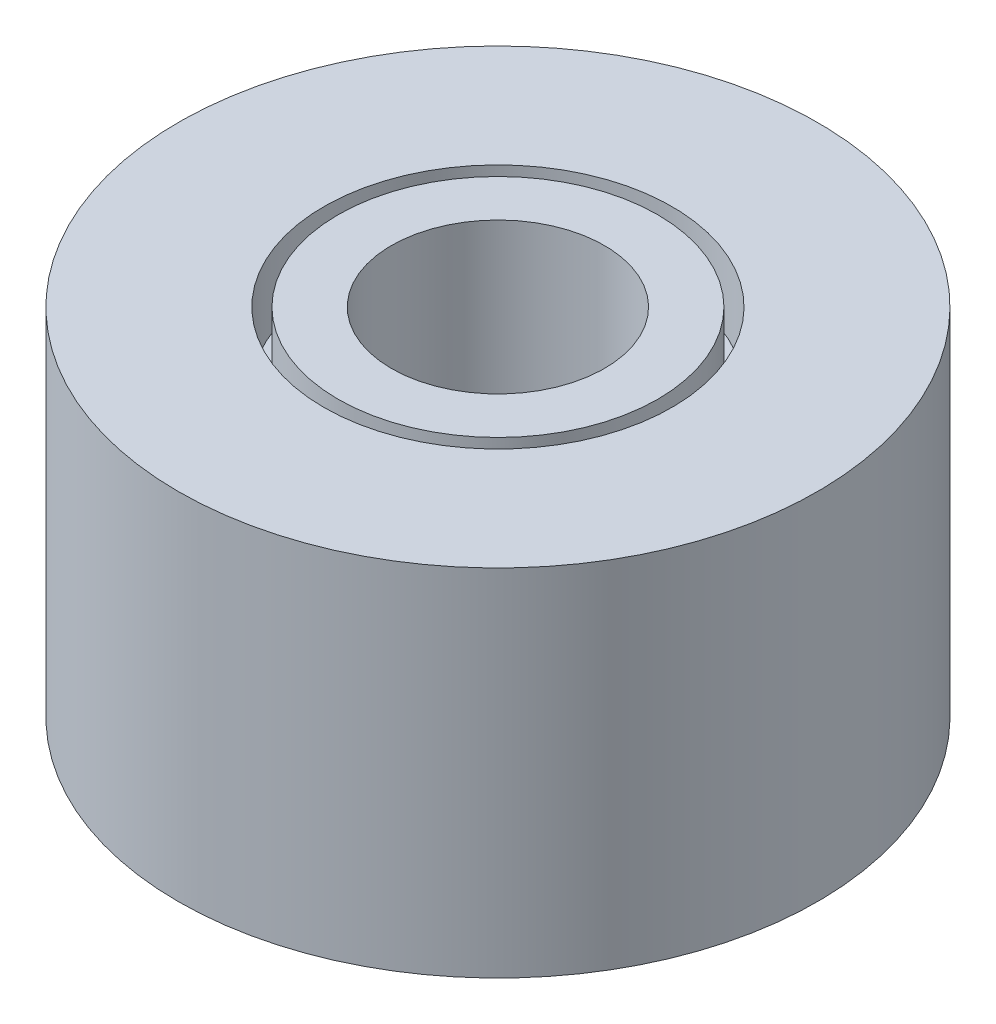
ISO-10303-21;
HEADER;
FILE_DESCRIPTION(('STEP AP214'),'2;1');
FILE_NAME('part.step','',(''),(''),'','','');
FILE_SCHEMA(('AUTOMOTIVE_DESIGN { 1 0 10303 214 1 1 1 1 }'));
ENDSEC;
DATA;
#1=APPLICATION_CONTEXT('core data for automotive mechanical design processes');
#2=APPLICATION_PROTOCOL_DEFINITION('international standard','automotive_design',2000,#1);
#3=PRODUCT_CONTEXT('',#1,'mechanical');
#4=PRODUCT('Part','Part','',(#3));
#5=PRODUCT_RELATED_PRODUCT_CATEGORY('part','',(#4));
#6=PRODUCT_DEFINITION_FORMATION('','',#4);
#7=PRODUCT_DEFINITION_CONTEXT('part definition',#1,'design');
#8=PRODUCT_DEFINITION('design','',#6,#7);
#9=PRODUCT_DEFINITION_SHAPE('','',#8);
#10=(LENGTH_UNIT() NAMED_UNIT(*) SI_UNIT(.MILLI.,.METRE.));
#11=(NAMED_UNIT(*) PLANE_ANGLE_UNIT() SI_UNIT($,.RADIAN.));
#12=(NAMED_UNIT(*) SI_UNIT($,.STERADIAN.) SOLID_ANGLE_UNIT());
#13=UNCERTAINTY_MEASURE_WITH_UNIT(LENGTH_MEASURE(1.E-05),#10,'distance_accuracy_value','');
#14=(GEOMETRIC_REPRESENTATION_CONTEXT(3) GLOBAL_UNCERTAINTY_ASSIGNED_CONTEXT((#13)) GLOBAL_UNIT_ASSIGNED_CONTEXT((#10,
#11,#12)) REPRESENTATION_CONTEXT('',''));
#15=CARTESIAN_POINT('',(0.,0.,0.));
#16=DIRECTION('',(0.,0.,1.));
#17=DIRECTION('',(1.,0.,0.));
#18=AXIS2_PLACEMENT_3D('',#15,#16,#17);
#19=CARTESIAN_POINT('',(0.,5.,0.));
#20=DIRECTION('',(0.,1.,0.));
#21=DIRECTION('',(0.,0.,1.));
#22=AXIS2_PLACEMENT_3D('',#19,#20,#21);
#23=PLANE('',#22);
#24=CARTESIAN_POINT('',(0.,5.,0.));
#25=DIRECTION('',(0.,1.,0.));
#26=DIRECTION('',(0.,0.,1.));
#27=AXIS2_PLACEMENT_3D('',#24,#25,#26);
#28=CIRCLE('',#27,1.5);
#29=CARTESIAN_POINT('',(0.,5.,1.5));
#30=VERTEX_POINT('',#29);
#31=EDGE_CURVE('E62',#30,#30,#28,.T.);
#32=ORIENTED_EDGE('',*,*,#31,.F.);
#33=EDGE_LOOP('',(#32));
#34=FACE_BOUND('',#33,.T.);
#35=CARTESIAN_POINT('',(0.,5.,0.));
#36=DIRECTION('',(0.,1.,0.));
#37=DIRECTION('',(0.,0.,1.));
#38=AXIS2_PLACEMENT_3D('',#35,#36,#37);
#39=CIRCLE('',#38,2.25);
#40=CARTESIAN_POINT('',(0.,5.,2.25));
#41=VERTEX_POINT('',#40);
#42=EDGE_CURVE('E88',#41,#41,#39,.T.);
#43=ORIENTED_EDGE('',*,*,#42,.T.);
#44=EDGE_LOOP('',(#43));
#45=FACE_BOUND('',#44,.T.);
#46=ADVANCED_FACE('F51',(#34,#45),#23,.T.);
#47=CARTESIAN_POINT('',(0.,0.,0.));
#48=DIRECTION('',(0.,1.,0.));
#49=DIRECTION('',(0.,0.,1.));
#50=AXIS2_PLACEMENT_3D('',#47,#48,#49);
#51=PLANE('',#50);
#52=CARTESIAN_POINT('',(0.,0.,0.));
#53=DIRECTION('',(0.,1.,0.));
#54=DIRECTION('',(0.,0.,1.));
#55=AXIS2_PLACEMENT_3D('',#52,#53,#54);
#56=CIRCLE('',#55,1.5);
#57=CARTESIAN_POINT('',(0.,0.,1.5));
#58=VERTEX_POINT('',#57);
#59=EDGE_CURVE('E64',#58,#58,#56,.T.);
#60=ORIENTED_EDGE('',*,*,#59,.T.);
#61=EDGE_LOOP('',(#60));
#62=FACE_BOUND('',#61,.T.);
#63=CARTESIAN_POINT('',(0.,0.,0.));
#64=DIRECTION('',(0.,1.,0.));
#65=DIRECTION('',(0.,0.,1.));
#66=AXIS2_PLACEMENT_3D('',#63,#64,#65);
#67=CIRCLE('',#66,2.25);
#68=CARTESIAN_POINT('',(0.,0.,2.25));
#69=VERTEX_POINT('',#68);
#70=EDGE_CURVE('E76',#69,#69,#67,.T.);
#71=ORIENTED_EDGE('',*,*,#70,.F.);
#72=EDGE_LOOP('',(#71));
#73=FACE_BOUND('',#72,.T.);
#74=ADVANCED_FACE('F113',(#62,#73),#51,.F.);
#75=CARTESIAN_POINT('',(0.,5.,0.));
#76=DIRECTION('',(0.,1.,0.));
#77=DIRECTION('',(0.,0.,1.));
#78=AXIS2_PLACEMENT_3D('',#75,#76,#77);
#79=CIRCLE('',#78,2.45);
#80=CARTESIAN_POINT('',(0.,5.,2.45));
#81=VERTEX_POINT('',#80);
#82=EDGE_CURVE('E82',#81,#81,#79,.T.);
#83=ORIENTED_EDGE('',*,*,#82,.F.);
#84=EDGE_LOOP('',(#83));
#85=FACE_BOUND('',#84,.T.);
#86=CARTESIAN_POINT('',(0.,5.,0.));
#87=DIRECTION('',(0.,1.,0.));
#88=DIRECTION('',(0.,0.,1.));
#89=AXIS2_PLACEMENT_3D('',#86,#87,#88);
#90=CIRCLE('',#89,4.5);
#91=CARTESIAN_POINT('',(0.,5.,4.5));
#92=VERTEX_POINT('',#91);
#93=EDGE_CURVE('E11',#92,#92,#90,.T.);
#94=ORIENTED_EDGE('',*,*,#93,.T.);
#95=EDGE_LOOP('',(#94));
#96=FACE_BOUND('',#95,.T.);
#97=ADVANCED_FACE('F110',(#85,#96),#23,.T.);
#98=CARTESIAN_POINT('',(0.,0.,0.));
#99=DIRECTION('',(0.,1.,0.));
#100=DIRECTION('',(1.,0.,0.));
#101=AXIS2_PLACEMENT_3D('',#98,#99,#100);
#102=CIRCLE('',#101,2.45);
#103=CARTESIAN_POINT('',(2.45,0.,0.));
#104=VERTEX_POINT('',#103);
#105=EDGE_CURVE('E70',#104,#104,#102,.T.);
#106=ORIENTED_EDGE('',*,*,#105,.T.);
#107=EDGE_LOOP('',(#106));
#108=FACE_BOUND('',#107,.T.);
#109=CARTESIAN_POINT('',(0.,0.,0.));
#110=DIRECTION('',(0.,1.,0.));
#111=DIRECTION('',(0.,0.,1.));
#112=AXIS2_PLACEMENT_3D('',#109,#110,#111);
#113=CIRCLE('',#112,4.5);
#114=CARTESIAN_POINT('',(0.,0.,4.5));
#115=VERTEX_POINT('',#114);
#116=EDGE_CURVE('E55',#115,#115,#113,.T.);
#117=ORIENTED_EDGE('',*,*,#116,.F.);
#118=EDGE_LOOP('',(#117));
#119=FACE_BOUND('',#118,.T.);
#120=ADVANCED_FACE('F112',(#108,#119),#51,.F.);
#121=CARTESIAN_POINT('',(0.,5.,0.));
#122=DIRECTION('',(0.,-1.,0.));
#123=DIRECTION('',(0.,0.,-1.));
#124=AXIS2_PLACEMENT_3D('',#121,#122,#123);
#125=CYLINDRICAL_SURFACE('',#124,4.5);
#126=ORIENTED_EDGE('',*,*,#93,.F.);
#127=EDGE_LOOP('',(#126));
#128=FACE_BOUND('',#127,.T.);
#129=ORIENTED_EDGE('',*,*,#116,.T.);
#130=EDGE_LOOP('',(#129));
#131=FACE_BOUND('',#130,.T.);
#132=ADVANCED_FACE('F53',(#128,#131),#125,.T.);
#133=CARTESIAN_POINT('',(0.,5.,0.));
#134=DIRECTION('',(0.,-1.,0.));
#135=DIRECTION('',(0.,0.,-1.));
#136=AXIS2_PLACEMENT_3D('',#133,#134,#135);
#137=CYLINDRICAL_SURFACE('',#136,1.5);
#138=ORIENTED_EDGE('',*,*,#31,.T.);
#139=EDGE_LOOP('',(#138));
#140=FACE_BOUND('',#139,.T.);
#141=ORIENTED_EDGE('',*,*,#59,.F.);
#142=EDGE_LOOP('',(#141));
#143=FACE_BOUND('',#142,.T.);
#144=ADVANCED_FACE('F141',(#140,#143),#137,.F.);
#145=CARTESIAN_POINT('',(0.,1.,0.));
#146=DIRECTION('',(0.,1.,0.));
#147=DIRECTION('',(0.,0.,1.));
#148=AXIS2_PLACEMENT_3D('',#145,#146,#147);
#149=PLANE('',#148);
#150=CARTESIAN_POINT('',(0.,1.,0.));
#151=DIRECTION('',(0.,1.,0.));
#152=DIRECTION('',(1.,0.,0.));
#153=AXIS2_PLACEMENT_3D('',#150,#151,#152);
#154=CIRCLE('',#153,2.45);
#155=CARTESIAN_POINT('',(2.45,1.,0.));
#156=VERTEX_POINT('',#155);
#157=EDGE_CURVE('E67',#156,#156,#154,.T.);
#158=ORIENTED_EDGE('',*,*,#157,.F.);
#159=EDGE_LOOP('',(#158));
#160=FACE_BOUND('',#159,.T.);
#161=CARTESIAN_POINT('',(0.,1.,0.));
#162=DIRECTION('',(0.,1.,0.));
#163=DIRECTION('',(0.,0.,1.));
#164=AXIS2_PLACEMENT_3D('',#161,#162,#163);
#165=CIRCLE('',#164,2.25);
#166=CARTESIAN_POINT('',(0.,1.,2.25));
#167=VERTEX_POINT('',#166);
#168=EDGE_CURVE('E73',#167,#167,#165,.T.);
#169=ORIENTED_EDGE('',*,*,#168,.T.);
#170=EDGE_LOOP('',(#169));
#171=FACE_BOUND('',#170,.T.);
#172=ADVANCED_FACE('F138',(#160,#171),#149,.F.);
#173=CARTESIAN_POINT('',(0.,1.,0.));
#174=DIRECTION('',(0.,-1.,0.));
#175=DIRECTION('',(0.,0.,-1.));
#176=AXIS2_PLACEMENT_3D('',#173,#174,#175);
#177=CYLINDRICAL_SURFACE('',#176,2.45);
#178=ORIENTED_EDGE('',*,*,#157,.T.);
#179=EDGE_LOOP('',(#178));
#180=FACE_BOUND('',#179,.T.);
#181=ORIENTED_EDGE('',*,*,#105,.F.);
#182=EDGE_LOOP('',(#181));
#183=FACE_BOUND('',#182,.T.);
#184=ADVANCED_FACE('F136',(#180,#183),#177,.F.);
#185=CARTESIAN_POINT('',(0.,1.,0.));
#186=DIRECTION('',(0.,-1.,0.));
#187=DIRECTION('',(0.,0.,-1.));
#188=AXIS2_PLACEMENT_3D('',#185,#186,#187);
#189=CYLINDRICAL_SURFACE('',#188,2.25);
#190=ORIENTED_EDGE('',*,*,#168,.F.);
#191=EDGE_LOOP('',(#190));
#192=FACE_BOUND('',#191,.T.);
#193=ORIENTED_EDGE('',*,*,#70,.T.);
#194=EDGE_LOOP('',(#193));
#195=FACE_BOUND('',#194,.T.);
#196=ADVANCED_FACE('F106',(#192,#195),#189,.T.);
#197=CARTESIAN_POINT('',(0.,4.,0.));
#198=DIRECTION('',(0.,1.,0.));
#199=DIRECTION('',(0.,0.,1.));
#200=AXIS2_PLACEMENT_3D('',#197,#198,#199);
#201=CYLINDRICAL_SURFACE('',#200,2.45);
#202=CARTESIAN_POINT('',(0.,4.,0.));
#203=DIRECTION('',(0.,1.,0.));
#204=DIRECTION('',(0.,0.,1.));
#205=AXIS2_PLACEMENT_3D('',#202,#203,#204);
#206=CIRCLE('',#205,2.45);
#207=CARTESIAN_POINT('',(0.,4.,2.45));
#208=VERTEX_POINT('',#207);
#209=EDGE_CURVE('E79',#208,#208,#206,.T.);
#210=ORIENTED_EDGE('',*,*,#209,.F.);
#211=EDGE_LOOP('',(#210));
#212=FACE_BOUND('',#211,.T.);
#213=ORIENTED_EDGE('',*,*,#82,.T.);
#214=EDGE_LOOP('',(#213));
#215=FACE_BOUND('',#214,.T.);
#216=ADVANCED_FACE('F100',(#212,#215),#201,.F.);
#217=CARTESIAN_POINT('',(0.,4.,0.));
#218=DIRECTION('',(0.,1.,0.));
#219=DIRECTION('',(0.,0.,1.));
#220=AXIS2_PLACEMENT_3D('',#217,#218,#219);
#221=PLANE('',#220);
#222=CARTESIAN_POINT('',(0.,4.,0.));
#223=DIRECTION('',(0.,1.,0.));
#224=DIRECTION('',(0.,0.,1.));
#225=AXIS2_PLACEMENT_3D('',#222,#223,#224);
#226=CIRCLE('',#225,2.25);
#227=CARTESIAN_POINT('',(0.,4.,2.25));
#228=VERTEX_POINT('',#227);
#229=EDGE_CURVE('E85',#228,#228,#226,.T.);
#230=ORIENTED_EDGE('',*,*,#229,.F.);
#231=EDGE_LOOP('',(#230));
#232=FACE_BOUND('',#231,.T.);
#233=ORIENTED_EDGE('',*,*,#209,.T.);
#234=EDGE_LOOP('',(#233));
#235=FACE_BOUND('',#234,.T.);
#236=ADVANCED_FACE('F97',(#232,#235),#221,.T.);
#237=CARTESIAN_POINT('',(0.,4.,0.));
#238=DIRECTION('',(0.,1.,0.));
#239=DIRECTION('',(0.,0.,1.));
#240=AXIS2_PLACEMENT_3D('',#237,#238,#239);
#241=CYLINDRICAL_SURFACE('',#240,2.25);
#242=ORIENTED_EDGE('',*,*,#229,.T.);
#243=EDGE_LOOP('',(#242));
#244=FACE_BOUND('',#243,.T.);
#245=ORIENTED_EDGE('',*,*,#42,.F.);
#246=EDGE_LOOP('',(#245));
#247=FACE_BOUND('',#246,.T.);
#248=ADVANCED_FACE('F94',(#244,#247),#241,.T.);
#249=CLOSED_SHELL('',(#46,#74,#97,#120,#132,#144,#172,#184,#196,#216,#236,#248));
#250=MANIFOLD_SOLID_BREP('B2',#249);
#251=ADVANCED_BREP_SHAPE_REPRESENTATION('',(#18,#250),#14);
#252=SHAPE_DEFINITION_REPRESENTATION(#9,#251);
ENDSEC;
END-ISO-10303-21;
